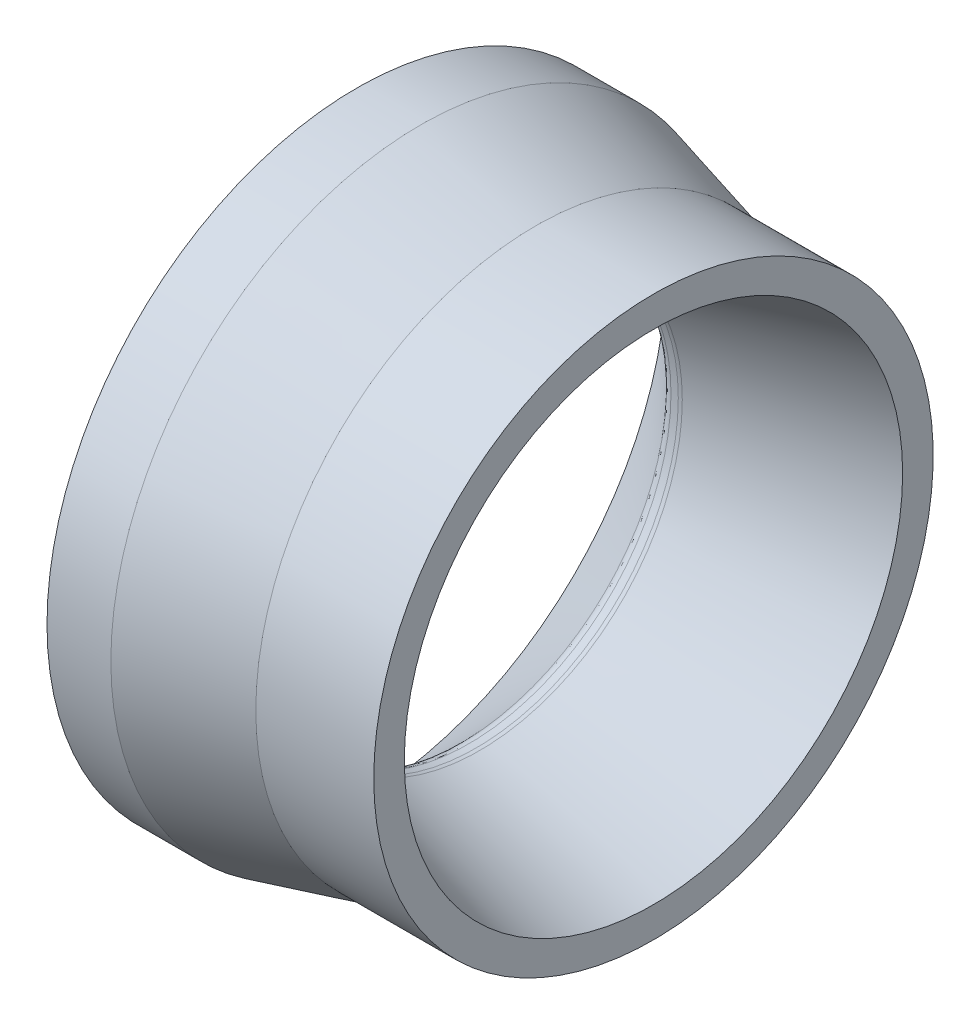
ISO-10303-21;
HEADER;
FILE_DESCRIPTION(('STEP AP214'),'2;1');
FILE_NAME('part.step','',(''),(''),'','','');
FILE_SCHEMA(('AUTOMOTIVE_DESIGN { 1 0 10303 214 1 1 1 1 }'));
ENDSEC;
DATA;
#1=APPLICATION_CONTEXT('core data for automotive mechanical design processes');
#2=APPLICATION_PROTOCOL_DEFINITION('international standard','automotive_design',2000,#1);
#3=PRODUCT_CONTEXT('',#1,'mechanical');
#4=PRODUCT('Part','Part','',(#3));
#5=PRODUCT_RELATED_PRODUCT_CATEGORY('part','',(#4));
#6=PRODUCT_DEFINITION_FORMATION('','',#4);
#7=PRODUCT_DEFINITION_CONTEXT('part definition',#1,'design');
#8=PRODUCT_DEFINITION('design','',#6,#7);
#9=PRODUCT_DEFINITION_SHAPE('','',#8);
#10=(LENGTH_UNIT() NAMED_UNIT(*) SI_UNIT(.MILLI.,.METRE.));
#11=(NAMED_UNIT(*) PLANE_ANGLE_UNIT() SI_UNIT($,.RADIAN.));
#12=(NAMED_UNIT(*) SI_UNIT($,.STERADIAN.) SOLID_ANGLE_UNIT());
#13=UNCERTAINTY_MEASURE_WITH_UNIT(LENGTH_MEASURE(1.E-05),#10,'distance_accuracy_value','');
#14=(GEOMETRIC_REPRESENTATION_CONTEXT(3) GLOBAL_UNCERTAINTY_ASSIGNED_CONTEXT((#13)) GLOBAL_UNIT_ASSIGNED_CONTEXT((#10,
#11,#12)) REPRESENTATION_CONTEXT('',''));
#15=CARTESIAN_POINT('',(0.,0.,0.));
#16=DIRECTION('',(0.,0.,1.));
#17=DIRECTION('',(1.,0.,0.));
#18=AXIS2_PLACEMENT_3D('',#15,#16,#17);
#19=CARTESIAN_POINT('',(20.2893708498984,0.,0.));
#20=DIRECTION('',(-1.,0.,0.));
#21=DIRECTION('',(0.,0.,1.));
#22=AXIS2_PLACEMENT_3D('',#19,#20,#21);
#23=TOROIDAL_SURFACE('',#22,15.64,0.799999999999998);
#24=CARTESIAN_POINT('',(20.2893708498984,0.,0.));
#25=DIRECTION('',(-1.,0.,0.));
#26=DIRECTION('',(0.,0.,1.));
#27=AXIS2_PLACEMENT_3D('',#24,#25,#26);
#28=CIRCLE('',#27,14.84);
#29=CARTESIAN_POINT('',(20.2893708498984,0.,14.84));
#30=VERTEX_POINT('',#29);
#31=EDGE_CURVE('E86',#30,#30,#28,.T.);
#32=ORIENTED_EDGE('',*,*,#31,.F.);
#33=EDGE_LOOP('',(#32));
#34=FACE_BOUND('',#33,.T.);
#35=CARTESIAN_POINT('',(19.7236854249492,0.,0.));
#36=DIRECTION('',(-1.,0.,0.));
#37=DIRECTION('',(0.,0.,1.));
#38=AXIS2_PLACEMENT_3D('',#35,#36,#37);
#39=CIRCLE('',#38,15.0743145750508);
#40=CARTESIAN_POINT('',(19.7236854249492,0.,15.0743145750508));
#41=VERTEX_POINT('',#40);
#42=EDGE_CURVE('E10',#41,#41,#39,.T.);
#43=ORIENTED_EDGE('',*,*,#42,.T.);
#44=EDGE_LOOP('',(#43));
#45=FACE_BOUND('',#44,.T.);
#46=ADVANCED_FACE('F47',(#34,#45),#23,.T.);
#47=CARTESIAN_POINT('',(12.0584083992187,0.,0.));
#48=DIRECTION('',(-1.,0.,0.));
#49=DIRECTION('',(0.,0.,1.));
#50=AXIS2_PLACEMENT_3D('',#47,#48,#49);
#51=CONICAL_SURFACE('',#50,22.7395916007812,0.78539816339745);
#52=ORIENTED_EDGE('',*,*,#42,.F.);
#53=EDGE_LOOP('',(#52));
#54=FACE_BOUND('',#53,.T.);
#55=CARTESIAN_POINT('',(12.0584083992187,0.,0.));
#56=DIRECTION('',(-1.,0.,0.));
#57=DIRECTION('',(0.,0.,1.));
#58=AXIS2_PLACEMENT_3D('',#55,#56,#57);
#59=CIRCLE('',#58,22.7395916007812);
#60=CARTESIAN_POINT('',(12.0584083992187,0.,22.7395916007812));
#61=VERTEX_POINT('',#60);
#62=EDGE_CURVE('E54',#61,#61,#59,.T.);
#63=ORIENTED_EDGE('',*,*,#62,.T.);
#64=EDGE_LOOP('',(#63));
#65=FACE_BOUND('',#64,.T.);
#66=ADVANCED_FACE('F94',(#54,#65),#51,.F.);
#67=CARTESIAN_POINT('',(0.,0.,0.));
#68=DIRECTION('',(-1.,0.,0.));
#69=DIRECTION('',(0.,0.,1.));
#70=AXIS2_PLACEMENT_3D('',#67,#68,#69);
#71=CYLINDRICAL_SURFACE('',#70,22.7395916007812);
#72=ORIENTED_EDGE('',*,*,#62,.F.);
#73=EDGE_LOOP('',(#72));
#74=FACE_BOUND('',#73,.T.);
#75=CARTESIAN_POINT('',(16.7463515798246,0.,0.));
#76=DIRECTION('',(-1.,0.,0.));
#77=DIRECTION('',(0.,0.,1.));
#78=AXIS2_PLACEMENT_3D('',#75,#76,#77);
#79=CIRCLE('',#78,22.7395916007812);
#80=CARTESIAN_POINT('',(16.7463515798246,0.,22.7395916007812));
#81=VERTEX_POINT('',#80);
#82=EDGE_CURVE('E59',#81,#81,#79,.T.);
#83=ORIENTED_EDGE('',*,*,#82,.T.);
#84=EDGE_LOOP('',(#83));
#85=FACE_BOUND('',#84,.T.);
#86=ADVANCED_FACE('F98',(#74,#85),#71,.T.);
#87=CARTESIAN_POINT('',(25.1843715599546,0.,0.));
#88=DIRECTION('',(-1.,0.,0.));
#89=DIRECTION('',(0.,0.,1.));
#90=AXIS2_PLACEMENT_3D('',#87,#88,#89);
#91=CONICAL_SURFACE('',#90,20.5350007100562,0.255556099511531);
#92=ORIENTED_EDGE('',*,*,#82,.F.);
#93=EDGE_LOOP('',(#92));
#94=FACE_BOUND('',#93,.T.);
#95=CARTESIAN_POINT('',(25.1843715599546,0.,0.));
#96=DIRECTION('',(-1.,0.,0.));
#97=DIRECTION('',(0.,0.,1.));
#98=AXIS2_PLACEMENT_3D('',#95,#96,#97);
#99=CIRCLE('',#98,20.5350007100562);
#100=CARTESIAN_POINT('',(25.1843715599546,0.,20.5350007100562));
#101=VERTEX_POINT('',#100);
#102=EDGE_CURVE('E64',#101,#101,#99,.T.);
#103=ORIENTED_EDGE('',*,*,#102,.T.);
#104=EDGE_LOOP('',(#103));
#105=FACE_BOUND('',#104,.T.);
#106=ADVANCED_FACE('F103',(#94,#105),#91,.T.);
#107=CARTESIAN_POINT('',(0.,0.,0.));
#108=DIRECTION('',(-1.,0.,0.));
#109=DIRECTION('',(0.,0.,1.));
#110=AXIS2_PLACEMENT_3D('',#107,#108,#109);
#111=CYLINDRICAL_SURFACE('',#110,20.5350007100562);
#112=ORIENTED_EDGE('',*,*,#102,.F.);
#113=EDGE_LOOP('',(#112));
#114=FACE_BOUND('',#113,.T.);
#115=CARTESIAN_POINT('',(33.8432894459154,0.,0.));
#116=DIRECTION('',(-1.,0.,0.));
#117=DIRECTION('',(0.,0.,1.));
#118=AXIS2_PLACEMENT_3D('',#115,#116,#117);
#119=CIRCLE('',#118,20.5350007100562);
#120=CARTESIAN_POINT('',(33.8432894459154,0.,20.5350007100562));
#121=VERTEX_POINT('',#120);
#122=EDGE_CURVE('E70',#121,#121,#119,.T.);
#123=ORIENTED_EDGE('',*,*,#122,.T.);
#124=EDGE_LOOP('',(#123));
#125=FACE_BOUND('',#124,.T.);
#126=ADVANCED_FACE('F109',(#114,#125),#111,.T.);
#127=CARTESIAN_POINT('',(33.8432894459154,20.5350007100562,0.));
#128=DIRECTION('',(-1.,0.,0.));
#129=DIRECTION('',(0.,0.,1.));
#130=AXIS2_PLACEMENT_3D('',#127,#128,#129);
#131=PLANE('',#130);
#132=ORIENTED_EDGE('',*,*,#122,.F.);
#133=EDGE_LOOP('',(#132));
#134=FACE_BOUND('',#133,.T.);
#135=CARTESIAN_POINT('',(33.8432894459154,0.,0.));
#136=DIRECTION('',(-1.,0.,0.));
#137=DIRECTION('',(0.,0.,1.));
#138=AXIS2_PLACEMENT_3D('',#135,#136,#137);
#139=CIRCLE('',#138,18.2926029012743);
#140=CARTESIAN_POINT('',(33.8432894459154,0.,18.2926029012743));
#141=VERTEX_POINT('',#140);
#142=EDGE_CURVE('E74',#141,#141,#139,.T.);
#143=ORIENTED_EDGE('',*,*,#142,.T.);
#144=EDGE_LOOP('',(#143));
#145=FACE_BOUND('',#144,.T.);
#146=ADVANCED_FACE('F113',(#134,#145),#131,.F.);
#147=CARTESIAN_POINT('',(21.0851665475151,0.,0.));
#148=DIRECTION('',(1.,0.,0.));
#149=DIRECTION('',(0.,0.,-1.));
#150=AXIS2_PLACEMENT_3D('',#147,#148,#149);
#151=CONICAL_SURFACE('',#150,14.8740741737109,0.26179938779915);
#152=ORIENTED_EDGE('',*,*,#142,.F.);
#153=EDGE_LOOP('',(#152));
#154=FACE_BOUND('',#153,.T.);
#155=CARTESIAN_POINT('',(21.0851665475151,0.,0.));
#156=DIRECTION('',(-1.,0.,0.));
#157=DIRECTION('',(0.,0.,1.));
#158=AXIS2_PLACEMENT_3D('',#155,#156,#157);
#159=CIRCLE('',#158,14.8740741737109);
#160=CARTESIAN_POINT('',(21.0851665475151,0.,14.8740741737109));
#161=VERTEX_POINT('',#160);
#162=EDGE_CURVE('E78',#161,#161,#159,.T.);
#163=ORIENTED_EDGE('',*,*,#162,.T.);
#164=EDGE_LOOP('',(#163));
#165=FACE_BOUND('',#164,.T.);
#166=ADVANCED_FACE('F117',(#154,#165),#151,.F.);
#167=CARTESIAN_POINT('',(20.8263475024125,0.,0.));
#168=DIRECTION('',(-1.,0.,0.));
#169=DIRECTION('',(0.,0.,1.));
#170=AXIS2_PLACEMENT_3D('',#167,#168,#169);
#171=TOROIDAL_SURFACE('',#170,15.84,1.);
#172=ORIENTED_EDGE('',*,*,#162,.F.);
#173=EDGE_LOOP('',(#172));
#174=FACE_BOUND('',#173,.T.);
#175=CARTESIAN_POINT('',(20.8263475024125,0.,0.));
#176=DIRECTION('',(-1.,0.,0.));
#177=DIRECTION('',(0.,0.,1.));
#178=AXIS2_PLACEMENT_3D('',#175,#176,#177);
#179=CIRCLE('',#178,14.84);
#180=CARTESIAN_POINT('',(20.8263475024125,0.,14.84));
#181=VERTEX_POINT('',#180);
#182=EDGE_CURVE('E82',#181,#181,#179,.T.);
#183=ORIENTED_EDGE('',*,*,#182,.T.);
#184=EDGE_LOOP('',(#183));
#185=FACE_BOUND('',#184,.T.);
#186=ADVANCED_FACE('F121',(#174,#185),#171,.T.);
#187=CARTESIAN_POINT('',(0.,0.,0.));
#188=DIRECTION('',(-1.,0.,0.));
#189=DIRECTION('',(0.,0.,1.));
#190=AXIS2_PLACEMENT_3D('',#187,#188,#189);
#191=CYLINDRICAL_SURFACE('',#190,14.84);
#192=ORIENTED_EDGE('',*,*,#182,.F.);
#193=EDGE_LOOP('',(#192));
#194=FACE_BOUND('',#193,.T.);
#195=ORIENTED_EDGE('',*,*,#31,.T.);
#196=EDGE_LOOP('',(#195));
#197=FACE_BOUND('',#196,.T.);
#198=ADVANCED_FACE('F91',(#194,#197),#191,.F.);
#199=CLOSED_SHELL('',(#46,#66,#86,#106,#126,#146,#166,#186,#198));
#200=MANIFOLD_SOLID_BREP('B2',#199);
#201=ADVANCED_BREP_SHAPE_REPRESENTATION('',(#18,#200),#14);
#202=SHAPE_DEFINITION_REPRESENTATION(#9,#201);
ENDSEC;
END-ISO-10303-21;
